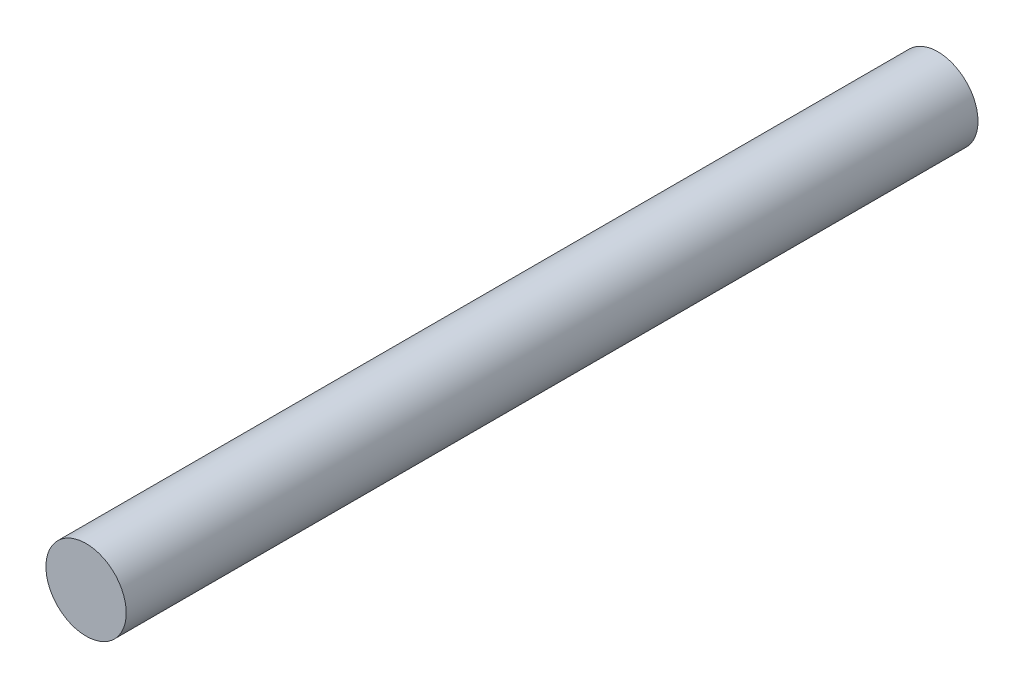
ISO-10303-21;
HEADER;
FILE_DESCRIPTION(('STEP AP214'),'2;1');
FILE_NAME('part.step','',(''),(''),'','','');
FILE_SCHEMA(('AUTOMOTIVE_DESIGN { 1 0 10303 214 1 1 1 1 }'));
ENDSEC;
DATA;
#1=APPLICATION_CONTEXT('core data for automotive mechanical design processes');
#2=APPLICATION_PROTOCOL_DEFINITION('international standard','automotive_design',2000,#1);
#3=PRODUCT_CONTEXT('',#1,'mechanical');
#4=PRODUCT('Part','Part','',(#3));
#5=PRODUCT_RELATED_PRODUCT_CATEGORY('part','',(#4));
#6=PRODUCT_DEFINITION_FORMATION('','',#4);
#7=PRODUCT_DEFINITION_CONTEXT('part definition',#1,'design');
#8=PRODUCT_DEFINITION('design','',#6,#7);
#9=PRODUCT_DEFINITION_SHAPE('','',#8);
#10=(LENGTH_UNIT() NAMED_UNIT(*) SI_UNIT(.MILLI.,.METRE.));
#11=(NAMED_UNIT(*) PLANE_ANGLE_UNIT() SI_UNIT($,.RADIAN.));
#12=(NAMED_UNIT(*) SI_UNIT($,.STERADIAN.) SOLID_ANGLE_UNIT());
#13=UNCERTAINTY_MEASURE_WITH_UNIT(LENGTH_MEASURE(1.E-05),#10,'distance_accuracy_value','');
#14=(GEOMETRIC_REPRESENTATION_CONTEXT(3) GLOBAL_UNCERTAINTY_ASSIGNED_CONTEXT((#13)) GLOBAL_UNIT_ASSIGNED_CONTEXT((#10,
#11,#12)) REPRESENTATION_CONTEXT('',''));
#15=CARTESIAN_POINT('',(0.,0.,0.));
#16=DIRECTION('',(0.,0.,1.));
#17=DIRECTION('',(1.,0.,0.));
#18=AXIS2_PLACEMENT_3D('',#15,#16,#17);
#19=CARTESIAN_POINT('',(0.,0.,35.));
#20=DIRECTION('',(0.,0.,-1.));
#21=DIRECTION('',(-1.,0.,0.));
#22=AXIS2_PLACEMENT_3D('',#19,#20,#21);
#23=CYLINDRICAL_SURFACE('',#22,1.65);
#24=CARTESIAN_POINT('',(0.,0.,35.));
#25=DIRECTION('',(0.,0.,1.));
#26=DIRECTION('',(1.,0.,0.));
#27=AXIS2_PLACEMENT_3D('',#24,#25,#26);
#28=CIRCLE('',#27,1.65);
#29=CARTESIAN_POINT('',(1.65,0.,35.));
#30=VERTEX_POINT('',#29);
#31=EDGE_CURVE('E10',#30,#30,#28,.T.);
#32=ORIENTED_EDGE('',*,*,#31,.F.);
#33=EDGE_LOOP('',(#32));
#34=FACE_BOUND('',#33,.T.);
#35=CARTESIAN_POINT('',(0.,0.,0.));
#36=DIRECTION('',(0.,0.,1.));
#37=DIRECTION('',(1.,0.,0.));
#38=AXIS2_PLACEMENT_3D('',#35,#36,#37);
#39=CIRCLE('',#38,1.65);
#40=CARTESIAN_POINT('',(1.65,0.,0.));
#41=VERTEX_POINT('',#40);
#42=EDGE_CURVE('E34',#41,#41,#39,.T.);
#43=ORIENTED_EDGE('',*,*,#42,.T.);
#44=EDGE_LOOP('',(#43));
#45=FACE_BOUND('',#44,.T.);
#46=ADVANCED_FACE('F31',(#34,#45),#23,.T.);
#47=CARTESIAN_POINT('',(0.,0.,35.));
#48=DIRECTION('',(0.,0.,1.));
#49=DIRECTION('',(1.,0.,0.));
#50=AXIS2_PLACEMENT_3D('',#47,#48,#49);
#51=PLANE('',#50);
#52=ORIENTED_EDGE('',*,*,#31,.T.);
#53=EDGE_LOOP('',(#52));
#54=FACE_BOUND('',#53,.T.);
#55=ADVANCED_FACE('F46',(#54),#51,.T.);
#56=CARTESIAN_POINT('',(0.,0.,0.));
#57=DIRECTION('',(0.,0.,1.));
#58=DIRECTION('',(1.,0.,0.));
#59=AXIS2_PLACEMENT_3D('',#56,#57,#58);
#60=PLANE('',#59);
#61=ORIENTED_EDGE('',*,*,#42,.F.);
#62=EDGE_LOOP('',(#61));
#63=FACE_BOUND('',#62,.T.);
#64=ADVANCED_FACE('F44',(#63),#60,.F.);
#65=CLOSED_SHELL('',(#46,#55,#64));
#66=MANIFOLD_SOLID_BREP('B2',#65);
#67=ADVANCED_BREP_SHAPE_REPRESENTATION('',(#18,#66),#14);
#68=SHAPE_DEFINITION_REPRESENTATION(#9,#67);
ENDSEC;
END-ISO-10303-21;
